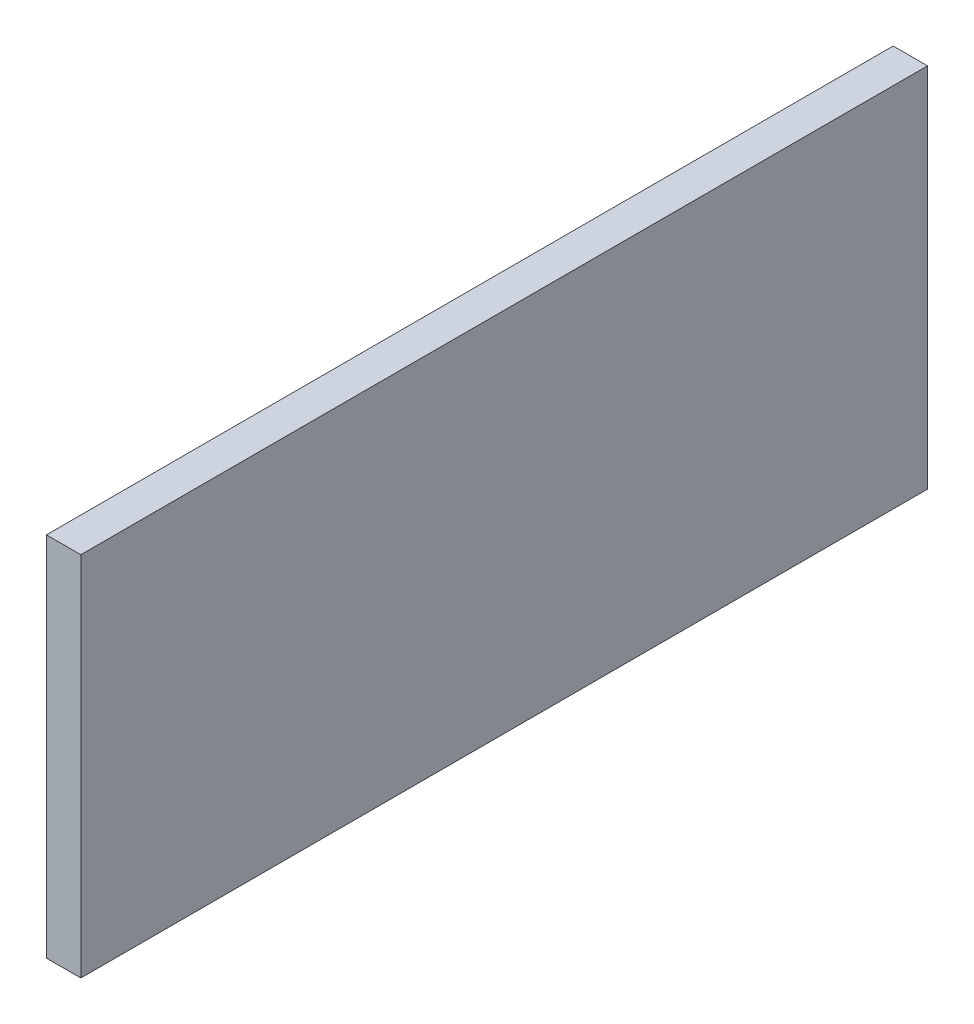
ISO-10303-21;
HEADER;
FILE_DESCRIPTION(('STEP AP214'),'2;1');
FILE_NAME('part.step','',(''),(''),'','','');
FILE_SCHEMA(('AUTOMOTIVE_DESIGN { 1 0 10303 214 1 1 1 1 }'));
ENDSEC;
DATA;
#1=APPLICATION_CONTEXT('core data for automotive mechanical design processes');
#2=APPLICATION_PROTOCOL_DEFINITION('international standard','automotive_design',2000,#1);
#3=PRODUCT_CONTEXT('',#1,'mechanical');
#4=PRODUCT('Part','Part','',(#3));
#5=PRODUCT_RELATED_PRODUCT_CATEGORY('part','',(#4));
#6=PRODUCT_DEFINITION_FORMATION('','',#4);
#7=PRODUCT_DEFINITION_CONTEXT('part definition',#1,'design');
#8=PRODUCT_DEFINITION('design','',#6,#7);
#9=PRODUCT_DEFINITION_SHAPE('','',#8);
#10=(LENGTH_UNIT() NAMED_UNIT(*) SI_UNIT(.MILLI.,.METRE.));
#11=(NAMED_UNIT(*) PLANE_ANGLE_UNIT() SI_UNIT($,.RADIAN.));
#12=(NAMED_UNIT(*) SI_UNIT($,.STERADIAN.) SOLID_ANGLE_UNIT());
#13=UNCERTAINTY_MEASURE_WITH_UNIT(LENGTH_MEASURE(1.E-05),#10,'distance_accuracy_value','');
#14=(GEOMETRIC_REPRESENTATION_CONTEXT(3) GLOBAL_UNCERTAINTY_ASSIGNED_CONTEXT((#13)) GLOBAL_UNIT_ASSIGNED_CONTEXT((#10,
#11,#12)) REPRESENTATION_CONTEXT('',''));
#15=CARTESIAN_POINT('',(0.,0.,0.));
#16=DIRECTION('',(0.,0.,1.));
#17=DIRECTION('',(1.,0.,0.));
#18=AXIS2_PLACEMENT_3D('',#15,#16,#17);
#19=CARTESIAN_POINT('',(4.7625,0.,-117.348));
#20=DIRECTION('',(0.,1.,0.));
#21=DIRECTION('',(0.,0.,1.));
#22=AXIS2_PLACEMENT_3D('',#19,#20,#21);
#23=PLANE('',#22);
#24=DIRECTION('',(0.,0.,-1.));
#25=VECTOR('',#24,1.);
#26=CARTESIAN_POINT('',(0.,0.,-117.348));
#27=LINE('',#26,#25);
#28=CARTESIAN_POINT('',(0.,0.,0.));
#29=VERTEX_POINT('',#28);
#30=CARTESIAN_POINT('',(0.,0.,-117.348));
#31=VERTEX_POINT('',#30);
#32=EDGE_CURVE('E107',#29,#31,#27,.T.);
#33=ORIENTED_EDGE('',*,*,#32,.T.);
#34=DIRECTION('',(-1.,0.,0.));
#35=VECTOR('',#34,1.);
#36=CARTESIAN_POINT('',(4.7625,0.,-117.348));
#37=LINE('',#36,#35);
#38=CARTESIAN_POINT('',(4.7625,0.,-117.348));
#39=VERTEX_POINT('',#38);
#40=EDGE_CURVE('E11',#39,#31,#37,.T.);
#41=ORIENTED_EDGE('',*,*,#40,.F.);
#42=DIRECTION('',(0.,0.,-1.));
#43=VECTOR('',#42,1.);
#44=CARTESIAN_POINT('',(4.7625,0.,-117.348));
#45=LINE('',#44,#43);
#46=CARTESIAN_POINT('',(4.7625,0.,0.));
#47=VERTEX_POINT('',#46);
#48=EDGE_CURVE('E91',#47,#39,#45,.T.);
#49=ORIENTED_EDGE('',*,*,#48,.F.);
#50=DIRECTION('',(-1.,0.,0.));
#51=VECTOR('',#50,1.);
#52=CARTESIAN_POINT('',(4.7625,0.,0.));
#53=LINE('',#52,#51);
#54=EDGE_CURVE('E103',#47,#29,#53,.T.);
#55=ORIENTED_EDGE('',*,*,#54,.T.);
#56=EDGE_LOOP('',(#33,#41,#49,#55));
#57=FACE_BOUND('',#56,.T.);
#58=ADVANCED_FACE('F39',(#57),#23,.F.);
#59=CARTESIAN_POINT('',(4.7625,50.8,-117.348));
#60=DIRECTION('',(0.,0.,1.));
#61=DIRECTION('',(1.,0.,0.));
#62=AXIS2_PLACEMENT_3D('',#59,#60,#61);
#63=PLANE('',#62);
#64=DIRECTION('',(0.,1.,0.));
#65=VECTOR('',#64,1.);
#66=CARTESIAN_POINT('',(0.,50.8,-117.348));
#67=LINE('',#66,#65);
#68=CARTESIAN_POINT('',(0.,50.8,-117.348));
#69=VERTEX_POINT('',#68);
#70=EDGE_CURVE('E96',#31,#69,#67,.T.);
#71=ORIENTED_EDGE('',*,*,#70,.T.);
#72=DIRECTION('',(-1.,0.,0.));
#73=VECTOR('',#72,1.);
#74=CARTESIAN_POINT('',(4.7625,50.8,-117.348));
#75=LINE('',#74,#73);
#76=CARTESIAN_POINT('',(4.7625,50.8,-117.348));
#77=VERTEX_POINT('',#76);
#78=EDGE_CURVE('E48',#77,#69,#75,.T.);
#79=ORIENTED_EDGE('',*,*,#78,.F.);
#80=DIRECTION('',(0.,1.,0.));
#81=VECTOR('',#80,1.);
#82=CARTESIAN_POINT('',(4.7625,50.8,-117.348));
#83=LINE('',#82,#81);
#84=EDGE_CURVE('E86',#39,#77,#83,.T.);
#85=ORIENTED_EDGE('',*,*,#84,.F.);
#86=ORIENTED_EDGE('',*,*,#40,.T.);
#87=EDGE_LOOP('',(#71,#79,#85,#86));
#88=FACE_BOUND('',#87,.T.);
#89=ADVANCED_FACE('F95',(#88),#63,.F.);
#90=CARTESIAN_POINT('',(4.7625,50.8,0.));
#91=DIRECTION('',(0.,-1.,0.));
#92=DIRECTION('',(0.,0.,-1.));
#93=AXIS2_PLACEMENT_3D('',#90,#91,#92);
#94=PLANE('',#93);
#95=DIRECTION('',(0.,0.,1.));
#96=VECTOR('',#95,1.);
#97=CARTESIAN_POINT('',(0.,50.8,0.));
#98=LINE('',#97,#96);
#99=CARTESIAN_POINT('',(0.,50.8,0.));
#100=VERTEX_POINT('',#99);
#101=EDGE_CURVE('E73',#69,#100,#98,.T.);
#102=ORIENTED_EDGE('',*,*,#101,.T.);
#103=DIRECTION('',(-1.,0.,0.));
#104=VECTOR('',#103,1.);
#105=CARTESIAN_POINT('',(4.7625,50.8,0.));
#106=LINE('',#105,#104);
#107=CARTESIAN_POINT('',(4.7625,50.8,0.));
#108=VERTEX_POINT('',#107);
#109=EDGE_CURVE('E98',#108,#100,#106,.T.);
#110=ORIENTED_EDGE('',*,*,#109,.F.);
#111=DIRECTION('',(0.,0.,1.));
#112=VECTOR('',#111,1.);
#113=CARTESIAN_POINT('',(4.7625,50.8,0.));
#114=LINE('',#113,#112);
#115=EDGE_CURVE('E89',#77,#108,#114,.T.);
#116=ORIENTED_EDGE('',*,*,#115,.F.);
#117=ORIENTED_EDGE('',*,*,#78,.T.);
#118=EDGE_LOOP('',(#102,#110,#116,#117));
#119=FACE_BOUND('',#118,.T.);
#120=ADVANCED_FACE('F99',(#119),#94,.F.);
#121=CARTESIAN_POINT('',(4.7625,0.,0.));
#122=DIRECTION('',(0.,0.,-1.));
#123=DIRECTION('',(-1.,0.,0.));
#124=AXIS2_PLACEMENT_3D('',#121,#122,#123);
#125=PLANE('',#124);
#126=DIRECTION('',(0.,-1.,0.));
#127=VECTOR('',#126,1.);
#128=CARTESIAN_POINT('',(0.,0.,0.));
#129=LINE('',#128,#127);
#130=EDGE_CURVE('E79',#100,#29,#129,.T.);
#131=ORIENTED_EDGE('',*,*,#130,.T.);
#132=ORIENTED_EDGE('',*,*,#54,.F.);
#133=DIRECTION('',(0.,-1.,0.));
#134=VECTOR('',#133,1.);
#135=CARTESIAN_POINT('',(4.7625,0.,0.));
#136=LINE('',#135,#134);
#137=EDGE_CURVE('E56',#108,#47,#136,.T.);
#138=ORIENTED_EDGE('',*,*,#137,.F.);
#139=ORIENTED_EDGE('',*,*,#109,.T.);
#140=EDGE_LOOP('',(#131,#132,#138,#139));
#141=FACE_BOUND('',#140,.T.);
#142=ADVANCED_FACE('F120',(#141),#125,.F.);
#143=CARTESIAN_POINT('',(4.7625,0.,0.));
#144=DIRECTION('',(-1.,0.,0.));
#145=DIRECTION('',(0.,0.,1.));
#146=AXIS2_PLACEMENT_3D('',#143,#144,#145);
#147=PLANE('',#146);
#148=ORIENTED_EDGE('',*,*,#48,.T.);
#149=ORIENTED_EDGE('',*,*,#84,.T.);
#150=ORIENTED_EDGE('',*,*,#115,.T.);
#151=ORIENTED_EDGE('',*,*,#137,.T.);
#152=EDGE_LOOP('',(#148,#149,#150,#151));
#153=FACE_BOUND('',#152,.T.);
#154=ADVANCED_FACE('F87',(#153),#147,.F.);
#155=CARTESIAN_POINT('',(0.,0.,0.));
#156=DIRECTION('',(-1.,0.,0.));
#157=DIRECTION('',(0.,0.,1.));
#158=AXIS2_PLACEMENT_3D('',#155,#156,#157);
#159=PLANE('',#158);
#160=ORIENTED_EDGE('',*,*,#32,.F.);
#161=ORIENTED_EDGE('',*,*,#130,.F.);
#162=ORIENTED_EDGE('',*,*,#101,.F.);
#163=ORIENTED_EDGE('',*,*,#70,.F.);
#164=EDGE_LOOP('',(#160,#161,#162,#163));
#165=FACE_BOUND('',#164,.T.);
#166=ADVANCED_FACE('F123',(#165),#159,.T.);
#167=CLOSED_SHELL('',(#58,#89,#120,#142,#154,#166));
#168=MANIFOLD_SOLID_BREP('B2',#167);
#169=ADVANCED_BREP_SHAPE_REPRESENTATION('',(#18,#168),#14);
#170=SHAPE_DEFINITION_REPRESENTATION(#9,#169);
ENDSEC;
END-ISO-10303-21;
